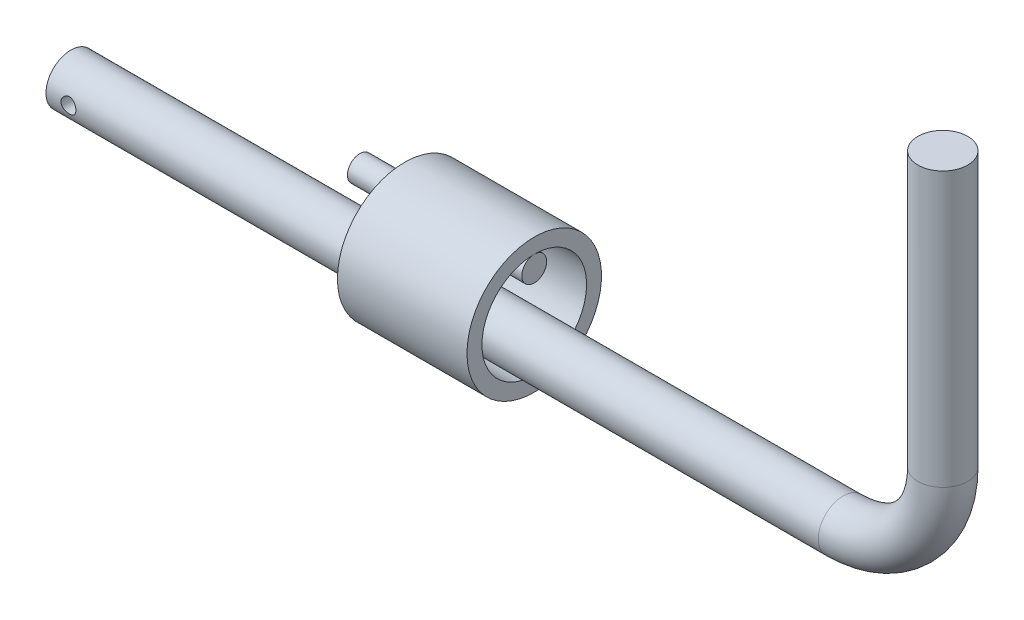
ISO-10303-21;
HEADER;
FILE_DESCRIPTION(('STEP AP214'),'2;1');
FILE_NAME('part.step','',(''),(''),'','','');
FILE_SCHEMA(('AUTOMOTIVE_DESIGN { 1 0 10303 214 1 1 1 1 }'));
ENDSEC;
DATA;
#1=APPLICATION_CONTEXT('core data for automotive mechanical design processes');
#2=APPLICATION_PROTOCOL_DEFINITION('international standard','automotive_design',2000,#1);
#3=PRODUCT_CONTEXT('',#1,'mechanical');
#4=PRODUCT('Part','Part','',(#3));
#5=PRODUCT_RELATED_PRODUCT_CATEGORY('part','',(#4));
#6=PRODUCT_DEFINITION_FORMATION('','',#4);
#7=PRODUCT_DEFINITION_CONTEXT('part definition',#1,'design');
#8=PRODUCT_DEFINITION('design','',#6,#7);
#9=PRODUCT_DEFINITION_SHAPE('','',#8);
#10=(LENGTH_UNIT() NAMED_UNIT(*) SI_UNIT(.MILLI.,.METRE.));
#11=(NAMED_UNIT(*) PLANE_ANGLE_UNIT() SI_UNIT($,.RADIAN.));
#12=(NAMED_UNIT(*) SI_UNIT($,.STERADIAN.) SOLID_ANGLE_UNIT());
#13=UNCERTAINTY_MEASURE_WITH_UNIT(LENGTH_MEASURE(1.E-05),#10,'distance_accuracy_value','');
#14=(GEOMETRIC_REPRESENTATION_CONTEXT(3) GLOBAL_UNCERTAINTY_ASSIGNED_CONTEXT((#13)) GLOBAL_UNIT_ASSIGNED_CONTEXT((#10,
#11,#12)) REPRESENTATION_CONTEXT('',''));
#15=CARTESIAN_POINT('',(0.,0.,0.));
#16=DIRECTION('',(0.,0.,1.));
#17=DIRECTION('',(1.,0.,0.));
#18=AXIS2_PLACEMENT_3D('',#15,#16,#17);
#19=CARTESIAN_POINT('',(58.,13.5,-1.11022302462516E-13));
#20=DIRECTION('',(1.,0.,0.));
#21=DIRECTION('',(0.,0.,-1.));
#22=AXIS2_PLACEMENT_3D('',#19,#20,#21);
#23=CYLINDRICAL_SURFACE('',#22,2.5);
#24=CARTESIAN_POINT('',(58.,13.5,-1.11022302462516E-13));
#25=DIRECTION('',(1.,0.,0.));
#26=DIRECTION('',(0.,0.,-1.));
#27=AXIS2_PLACEMENT_3D('',#24,#25,#26);
#28=CIRCLE('',#27,2.5);
#29=CARTESIAN_POINT('',(58.,13.5,-2.50000000000011));
#30=VERTEX_POINT('',#29);
#31=EDGE_CURVE('E11',#30,#30,#28,.T.);
#32=ORIENTED_EDGE('',*,*,#31,.T.);
#33=EDGE_LOOP('',(#32));
#34=FACE_BOUND('',#33,.T.);
#35=CARTESIAN_POINT('',(93.,13.5,-1.11022302462516E-13));
#36=DIRECTION('',(1.,0.,0.));
#37=DIRECTION('',(0.,0.,-1.));
#38=AXIS2_PLACEMENT_3D('',#35,#36,#37);
#39=CIRCLE('',#38,2.5);
#40=CARTESIAN_POINT('',(93.,13.5,-2.50000000000011));
#41=VERTEX_POINT('',#40);
#42=EDGE_CURVE('E52',#41,#41,#39,.T.);
#43=ORIENTED_EDGE('',*,*,#42,.F.);
#44=EDGE_LOOP('',(#43));
#45=FACE_BOUND('',#44,.T.);
#46=ADVANCED_FACE('F49',(#34,#45),#23,.T.);
#47=CARTESIAN_POINT('',(58.,13.5,-1.11022302462516E-13));
#48=DIRECTION('',(1.,0.,0.));
#49=DIRECTION('',(0.,0.,-1.));
#50=AXIS2_PLACEMENT_3D('',#47,#48,#49);
#51=PLANE('',#50);
#52=ORIENTED_EDGE('',*,*,#31,.F.);
#53=EDGE_LOOP('',(#52));
#54=FACE_BOUND('',#53,.T.);
#55=ADVANCED_FACE('F64',(#54),#51,.F.);
#56=CARTESIAN_POINT('',(93.,13.5,-1.11022302462516E-13));
#57=DIRECTION('',(1.,0.,0.));
#58=DIRECTION('',(0.,0.,-1.));
#59=AXIS2_PLACEMENT_3D('',#56,#57,#58);
#60=PLANE('',#59);
#61=ORIENTED_EDGE('',*,*,#42,.T.);
#62=EDGE_LOOP('',(#61));
#63=FACE_BOUND('',#62,.T.);
#64=ADVANCED_FACE('F61',(#63),#60,.T.);
#65=CLOSED_SHELL('',(#46,#55,#64));
#66=MANIFOLD_SOLID_BREP('B2',#65);
#67=CARTESIAN_POINT('',(93.,5.50000000000001,-1.11022302462516E-13));
#68=DIRECTION('',(-1.,0.,0.));
#69=DIRECTION('',(0.,0.,1.));
#70=AXIS2_PLACEMENT_3D('',#67,#68,#69);
#71=CYLINDRICAL_SURFACE('',#70,13.5);
#72=CARTESIAN_POINT('',(93.,5.50000000000001,-1.11022302462516E-13));
#73=DIRECTION('',(-1.,0.,0.));
#74=DIRECTION('',(0.,0.,1.));
#75=AXIS2_PLACEMENT_3D('',#72,#73,#74);
#76=CIRCLE('',#75,13.5);
#77=CARTESIAN_POINT('',(93.,5.50000000000001,13.4999999999999));
#78=VERTEX_POINT('',#77);
#79=EDGE_CURVE('E48',#78,#78,#76,.T.);
#80=CARTESIAN_POINT('',(67.,5.50000000000001,-1.11022302462516E-13));
#81=DIRECTION('',(-1.,0.,0.));
#82=DIRECTION('',(0.,0.,1.));
#83=AXIS2_PLACEMENT_3D('',#80,#81,#82);
#84=CIRCLE('',#83,13.5);
#85=CARTESIAN_POINT('',(67.,5.50000000000001,13.4999999999999));
#86=VERTEX_POINT('',#85);
#87=EDGE_CURVE('E103',#86,#86,#84,.T.);
#88=CARTESIAN_POINT('',(93.,5.50000000000001,13.4999999999999));
#89=CARTESIAN_POINT('',(92.7291666666667,5.50000000000001,13.4999999999999));
#90=CARTESIAN_POINT('',(92.4583333333333,5.50000000000001,13.4999999999999));
#91=CARTESIAN_POINT('',(91.9166666666667,5.50000000000001,13.4999999999999));
#92=CARTESIAN_POINT('',(91.6458333333333,5.50000000000001,13.4999999999999));
#93=CARTESIAN_POINT('',(91.1041666666667,5.50000000000001,13.4999999999999));
#94=CARTESIAN_POINT('',(90.8333333333333,5.50000000000001,13.4999999999999));
#95=CARTESIAN_POINT('',(90.2916666666667,5.50000000000001,13.4999999999999));
#96=CARTESIAN_POINT('',(90.0208333333333,5.50000000000001,13.4999999999999));
#97=CARTESIAN_POINT('',(89.4791666666667,5.50000000000001,13.4999999999999));
#98=CARTESIAN_POINT('',(89.2083333333333,5.50000000000001,13.4999999999999));
#99=CARTESIAN_POINT('',(88.6666666666667,5.50000000000001,13.4999999999999));
#100=CARTESIAN_POINT('',(88.3958333333333,5.50000000000001,13.4999999999999));
#101=CARTESIAN_POINT('',(87.8541666666667,5.50000000000001,13.4999999999999));
#102=CARTESIAN_POINT('',(87.5833333333333,5.50000000000001,13.4999999999999));
#103=CARTESIAN_POINT('',(87.0416666666667,5.50000000000001,13.4999999999999));
#104=CARTESIAN_POINT('',(86.7708333333333,5.50000000000001,13.4999999999999));
#105=CARTESIAN_POINT('',(86.2291666666667,5.50000000000001,13.4999999999999));
#106=CARTESIAN_POINT('',(85.9583333333333,5.50000000000001,13.4999999999999));
#107=CARTESIAN_POINT('',(85.4166666666667,5.50000000000001,13.4999999999999));
#108=CARTESIAN_POINT('',(85.1458333333333,5.50000000000001,13.4999999999999));
#109=CARTESIAN_POINT('',(84.6041666666667,5.50000000000001,13.4999999999999));
#110=CARTESIAN_POINT('',(84.3333333333333,5.50000000000001,13.4999999999999));
#111=CARTESIAN_POINT('',(83.7916666666667,5.50000000000001,13.4999999999999));
#112=CARTESIAN_POINT('',(83.5208333333333,5.50000000000001,13.4999999999999));
#113=CARTESIAN_POINT('',(82.9791666666667,5.50000000000001,13.4999999999999));
#114=CARTESIAN_POINT('',(82.7083333333333,5.50000000000001,13.4999999999999));
#115=CARTESIAN_POINT('',(82.1666666666667,5.50000000000001,13.4999999999999));
#116=CARTESIAN_POINT('',(81.8958333333333,5.50000000000001,13.4999999999999));
#117=CARTESIAN_POINT('',(81.3541666666667,5.50000000000001,13.4999999999999));
#118=CARTESIAN_POINT('',(81.0833333333333,5.50000000000001,13.4999999999999));
#119=CARTESIAN_POINT('',(80.5416666666667,5.50000000000001,13.4999999999999));
#120=CARTESIAN_POINT('',(80.2708333333333,5.50000000000001,13.4999999999999));
#121=CARTESIAN_POINT('',(79.7291666666667,5.50000000000001,13.4999999999999));
#122=CARTESIAN_POINT('',(79.4583333333333,5.50000000000001,13.4999999999999));
#123=CARTESIAN_POINT('',(78.9166666666667,5.50000000000001,13.4999999999999));
#124=CARTESIAN_POINT('',(78.6458333333333,5.50000000000001,13.4999999999999));
#125=CARTESIAN_POINT('',(78.1041666666667,5.50000000000001,13.4999999999999));
#126=CARTESIAN_POINT('',(77.8333333333333,5.50000000000001,13.4999999999999));
#127=CARTESIAN_POINT('',(77.2916666666667,5.50000000000001,13.4999999999999));
#128=CARTESIAN_POINT('',(77.0208333333333,5.50000000000001,13.4999999999999));
#129=CARTESIAN_POINT('',(76.4791666666667,5.50000000000001,13.4999999999999));
#130=CARTESIAN_POINT('',(76.2083333333334,5.50000000000001,13.4999999999999));
#131=CARTESIAN_POINT('',(75.6666666666667,5.50000000000001,13.4999999999999));
#132=CARTESIAN_POINT('',(75.3958333333333,5.50000000000001,13.4999999999999));
#133=CARTESIAN_POINT('',(74.8541666666667,5.50000000000001,13.4999999999999));
#134=CARTESIAN_POINT('',(74.5833333333333,5.50000000000001,13.4999999999999));
#135=CARTESIAN_POINT('',(74.0416666666667,5.50000000000001,13.4999999999999));
#136=CARTESIAN_POINT('',(73.7708333333333,5.50000000000001,13.4999999999999));
#137=CARTESIAN_POINT('',(73.2291666666667,5.50000000000001,13.4999999999999));
#138=CARTESIAN_POINT('',(72.9583333333333,5.50000000000001,13.4999999999999));
#139=CARTESIAN_POINT('',(72.4166666666667,5.50000000000001,13.4999999999999));
#140=CARTESIAN_POINT('',(72.1458333333333,5.50000000000001,13.4999999999999));
#141=CARTESIAN_POINT('',(71.6041666666667,5.50000000000001,13.4999999999999));
#142=CARTESIAN_POINT('',(71.3333333333333,5.50000000000001,13.4999999999999));
#143=CARTESIAN_POINT('',(70.7916666666667,5.50000000000001,13.4999999999999));
#144=CARTESIAN_POINT('',(70.5208333333333,5.50000000000001,13.4999999999999));
#145=CARTESIAN_POINT('',(69.9791666666667,5.50000000000001,13.4999999999999));
#146=CARTESIAN_POINT('',(69.7083333333333,5.50000000000001,13.4999999999999));
#147=CARTESIAN_POINT('',(69.1666666666667,5.50000000000001,13.4999999999999));
#148=CARTESIAN_POINT('',(68.8958333333334,5.50000000000001,13.4999999999999));
#149=CARTESIAN_POINT('',(68.3541666666667,5.50000000000001,13.4999999999999));
#150=CARTESIAN_POINT('',(68.0833333333333,5.50000000000001,13.4999999999999));
#151=CARTESIAN_POINT('',(67.5416666666667,5.50000000000001,13.4999999999999));
#152=CARTESIAN_POINT('',(67.2708333333333,5.50000000000001,13.4999999999999));
#153=CARTESIAN_POINT('',(67.,5.50000000000001,13.4999999999999));
#154=B_SPLINE_CURVE_WITH_KNOTS('',3,(#88,#89,#90,#91,#92,#93,#94,#95,#96,#97,#98,#99,#100,#101,
#102,#103,#104,#105,#106,#107,#108,#109,#110,#111,#112,#113,#114,#115,#116,#117,#118,#119,#120,
#121,#122,#123,#124,#125,#126,#127,#128,#129,#130,#131,#132,#133,#134,#135,#136,#137,#138,#139,
#140,#141,#142,#143,#144,#145,#146,#147,#148,#149,#150,#151,#152,#153),.UNSPECIFIED.,.F.,.F.,(4,
2,2,2,2,2,2,2,2,2,2,2,2,2,2,2,2,2,2,2,2,2,2,2,2,2,2,2,2,2,2,2,4),(0.,0.812499999999994,
1.62499999999999,2.4375,3.24999999999999,4.0625,4.87499999999999,5.68749999999998,
6.49999999999999,7.31249999999999,8.12499999999999,8.93749999999999,9.74999999999999,10.5625,
11.375,12.1875,13.,13.8125,14.625,15.4375,16.25,17.0625,17.875,18.6875,19.5,20.3125,21.125,
21.9375,22.75,23.5625,24.375,25.1875,26.),.UNSPECIFIED.);
#155=EDGE_CURVE('BSEAM100',#78,#86,#154,.T.);
#156=ORIENTED_EDGE('',*,*,#79,.T.);
#157=ORIENTED_EDGE('',*,*,#87,.F.);
#158=ORIENTED_EDGE('',*,*,#155,.T.);
#159=ORIENTED_EDGE('',*,*,#155,.F.);
#160=EDGE_LOOP('',(#156,#158,#157,#159));
#161=FACE_BOUND('',#160,.T.);
#162=ADVANCED_FACE('F100',(#161),#71,.T.);
#163=CARTESIAN_POINT('',(93.,5.50000000000001,-1.11022302462516E-13));
#164=DIRECTION('',(-1.,0.,0.));
#165=DIRECTION('',(0.,0.,1.));
#166=AXIS2_PLACEMENT_3D('',#163,#164,#165);
#167=PLANE('',#166);
#168=CARTESIAN_POINT('',(93.,5.50000000000001,-1.11022302462516E-13));
#169=DIRECTION('',(-1.,0.,0.));
#170=DIRECTION('',(0.,0.,1.));
#171=AXIS2_PLACEMENT_3D('',#168,#169,#170);
#172=CIRCLE('',#171,10.5);
#173=CARTESIAN_POINT('',(93.,5.50000000000001,10.4999999999999));
#174=VERTEX_POINT('',#173);
#175=EDGE_CURVE('E110',#174,#174,#172,.T.);
#176=ORIENTED_EDGE('',*,*,#175,.T.);
#177=EDGE_LOOP('',(#176));
#178=FACE_BOUND('',#177,.T.);
#179=ORIENTED_EDGE('',*,*,#79,.F.);
#180=EDGE_LOOP('',(#179));
#181=FACE_BOUND('',#180,.T.);
#182=ADVANCED_FACE('F118',(#178,#181),#167,.F.);
#183=CARTESIAN_POINT('',(67.,5.50000000000001,-1.11022302462516E-13));
#184=DIRECTION('',(-1.,0.,0.));
#185=DIRECTION('',(0.,0.,1.));
#186=AXIS2_PLACEMENT_3D('',#183,#184,#185);
#187=PLANE('',#186);
#188=CARTESIAN_POINT('',(67.,5.50000000000001,-1.11022302462516E-13));
#189=DIRECTION('',(-1.,0.,0.));
#190=DIRECTION('',(0.,0.,1.));
#191=AXIS2_PLACEMENT_3D('',#188,#189,#190);
#192=CIRCLE('',#191,10.5);
#193=CARTESIAN_POINT('',(67.,5.50000000000001,10.4999999999999));
#194=VERTEX_POINT('',#193);
#195=EDGE_CURVE('E112',#194,#194,#192,.T.);
#196=ORIENTED_EDGE('',*,*,#195,.F.);
#197=EDGE_LOOP('',(#196));
#198=FACE_BOUND('',#197,.T.);
#199=ORIENTED_EDGE('',*,*,#87,.T.);
#200=EDGE_LOOP('',(#199));
#201=FACE_BOUND('',#200,.T.);
#202=ADVANCED_FACE('F124',(#198,#201),#187,.T.);
#203=CARTESIAN_POINT('',(93.,5.50000000000001,-1.11022302462516E-13));
#204=DIRECTION('',(-1.,0.,0.));
#205=DIRECTION('',(0.,0.,1.));
#206=AXIS2_PLACEMENT_3D('',#203,#204,#205);
#207=CYLINDRICAL_SURFACE('',#206,10.5);
#208=CARTESIAN_POINT('',(93.,5.50000000000001,10.4999999999999));
#209=CARTESIAN_POINT('',(92.7291666666667,5.50000000000001,10.4999999999999));
#210=CARTESIAN_POINT('',(92.4583333333333,5.50000000000001,10.4999999999999));
#211=CARTESIAN_POINT('',(91.9166666666667,5.50000000000001,10.4999999999999));
#212=CARTESIAN_POINT('',(91.6458333333333,5.50000000000001,10.4999999999999));
#213=CARTESIAN_POINT('',(91.1041666666667,5.50000000000001,10.4999999999999));
#214=CARTESIAN_POINT('',(90.8333333333333,5.50000000000001,10.4999999999999));
#215=CARTESIAN_POINT('',(90.2916666666667,5.50000000000001,10.4999999999999));
#216=CARTESIAN_POINT('',(90.0208333333333,5.50000000000001,10.4999999999999));
#217=CARTESIAN_POINT('',(89.4791666666667,5.50000000000001,10.4999999999999));
#218=CARTESIAN_POINT('',(89.2083333333333,5.50000000000001,10.4999999999999));
#219=CARTESIAN_POINT('',(88.6666666666667,5.50000000000001,10.4999999999999));
#220=CARTESIAN_POINT('',(88.3958333333333,5.50000000000001,10.4999999999999));
#221=CARTESIAN_POINT('',(87.8541666666667,5.50000000000001,10.4999999999999));
#222=CARTESIAN_POINT('',(87.5833333333333,5.50000000000001,10.4999999999999));
#223=CARTESIAN_POINT('',(87.0416666666667,5.50000000000001,10.4999999999999));
#224=CARTESIAN_POINT('',(86.7708333333333,5.50000000000001,10.4999999999999));
#225=CARTESIAN_POINT('',(86.2291666666667,5.50000000000001,10.4999999999999));
#226=CARTESIAN_POINT('',(85.9583333333333,5.50000000000001,10.4999999999999));
#227=CARTESIAN_POINT('',(85.4166666666667,5.50000000000001,10.4999999999999));
#228=CARTESIAN_POINT('',(85.1458333333333,5.50000000000001,10.4999999999999));
#229=CARTESIAN_POINT('',(84.6041666666667,5.50000000000001,10.4999999999999));
#230=CARTESIAN_POINT('',(84.3333333333333,5.50000000000001,10.4999999999999));
#231=CARTESIAN_POINT('',(83.7916666666667,5.50000000000001,10.4999999999999));
#232=CARTESIAN_POINT('',(83.5208333333333,5.50000000000001,10.4999999999999));
#233=CARTESIAN_POINT('',(82.9791666666667,5.50000000000001,10.4999999999999));
#234=CARTESIAN_POINT('',(82.7083333333333,5.50000000000001,10.4999999999999));
#235=CARTESIAN_POINT('',(82.1666666666667,5.50000000000001,10.4999999999999));
#236=CARTESIAN_POINT('',(81.8958333333333,5.50000000000001,10.4999999999999));
#237=CARTESIAN_POINT('',(81.3541666666667,5.50000000000001,10.4999999999999));
#238=CARTESIAN_POINT('',(81.0833333333333,5.50000000000001,10.4999999999999));
#239=CARTESIAN_POINT('',(80.5416666666667,5.50000000000001,10.4999999999999));
#240=CARTESIAN_POINT('',(80.2708333333333,5.50000000000001,10.4999999999999));
#241=CARTESIAN_POINT('',(79.7291666666667,5.50000000000001,10.4999999999999));
#242=CARTESIAN_POINT('',(79.4583333333333,5.50000000000001,10.4999999999999));
#243=CARTESIAN_POINT('',(78.9166666666667,5.50000000000001,10.4999999999999));
#244=CARTESIAN_POINT('',(78.6458333333333,5.50000000000001,10.4999999999999));
#245=CARTESIAN_POINT('',(78.1041666666667,5.50000000000001,10.4999999999999));
#246=CARTESIAN_POINT('',(77.8333333333333,5.50000000000001,10.4999999999999));
#247=CARTESIAN_POINT('',(77.2916666666667,5.50000000000001,10.4999999999999));
#248=CARTESIAN_POINT('',(77.0208333333333,5.50000000000001,10.4999999999999));
#249=CARTESIAN_POINT('',(76.4791666666667,5.50000000000001,10.4999999999999));
#250=CARTESIAN_POINT('',(76.2083333333334,5.50000000000001,10.4999999999999));
#251=CARTESIAN_POINT('',(75.6666666666667,5.50000000000001,10.4999999999999));
#252=CARTESIAN_POINT('',(75.3958333333333,5.50000000000001,10.4999999999999));
#253=CARTESIAN_POINT('',(74.8541666666667,5.50000000000001,10.4999999999999));
#254=CARTESIAN_POINT('',(74.5833333333333,5.50000000000001,10.4999999999999));
#255=CARTESIAN_POINT('',(74.0416666666667,5.50000000000001,10.4999999999999));
#256=CARTESIAN_POINT('',(73.7708333333333,5.50000000000001,10.4999999999999));
#257=CARTESIAN_POINT('',(73.2291666666667,5.50000000000001,10.4999999999999));
#258=CARTESIAN_POINT('',(72.9583333333333,5.50000000000001,10.4999999999999));
#259=CARTESIAN_POINT('',(72.4166666666667,5.50000000000001,10.4999999999999));
#260=CARTESIAN_POINT('',(72.1458333333333,5.50000000000001,10.4999999999999));
#261=CARTESIAN_POINT('',(71.6041666666667,5.50000000000001,10.4999999999999));
#262=CARTESIAN_POINT('',(71.3333333333333,5.50000000000001,10.4999999999999));
#263=CARTESIAN_POINT('',(70.7916666666667,5.50000000000001,10.4999999999999));
#264=CARTESIAN_POINT('',(70.5208333333333,5.50000000000001,10.4999999999999));
#265=CARTESIAN_POINT('',(69.9791666666667,5.50000000000001,10.4999999999999));
#266=CARTESIAN_POINT('',(69.7083333333333,5.50000000000001,10.4999999999999));
#267=CARTESIAN_POINT('',(69.1666666666667,5.50000000000001,10.4999999999999));
#268=CARTESIAN_POINT('',(68.8958333333334,5.50000000000001,10.4999999999999));
#269=CARTESIAN_POINT('',(68.3541666666667,5.50000000000001,10.4999999999999));
#270=CARTESIAN_POINT('',(68.0833333333333,5.50000000000001,10.4999999999999));
#271=CARTESIAN_POINT('',(67.5416666666667,5.50000000000001,10.4999999999999));
#272=CARTESIAN_POINT('',(67.2708333333333,5.50000000000001,10.4999999999999));
#273=CARTESIAN_POINT('',(67.,5.50000000000001,10.4999999999999));
#274=B_SPLINE_CURVE_WITH_KNOTS('',3,(#208,#209,#210,#211,#212,#213,#214,#215,#216,#217,#218,
#219,#220,#221,#222,#223,#224,#225,#226,#227,#228,#229,#230,#231,#232,#233,#234,#235,#236,#237,
#238,#239,#240,#241,#242,#243,#244,#245,#246,#247,#248,#249,#250,#251,#252,#253,#254,#255,#256,
#257,#258,#259,#260,#261,#262,#263,#264,#265,#266,#267,#268,#269,#270,#271,#272,#273),
.UNSPECIFIED.,.F.,.F.,(4,2,2,2,2,2,2,2,2,2,2,2,2,2,2,2,2,2,2,2,2,2,2,2,2,2,2,2,2,2,2,2,4),(0.,
0.812500000000008,1.625,2.43750000000001,3.25,4.06250000000001,4.875,5.6875,6.50000000000001,
7.3125,8.12500000000001,8.9375,9.75000000000001,10.5625,11.375,12.1875,13.,13.8125,14.625,
15.4375,16.25,17.0625,17.875,18.6875,19.5,20.3125,21.125,21.9375,22.75,23.5625,24.375,25.1875,
26.),.UNSPECIFIED.);
#275=EDGE_CURVE('BSEAM121',#174,#194,#274,.T.);
#276=ORIENTED_EDGE('',*,*,#175,.F.);
#277=ORIENTED_EDGE('',*,*,#195,.T.);
#278=ORIENTED_EDGE('',*,*,#275,.T.);
#279=ORIENTED_EDGE('',*,*,#275,.F.);
#280=EDGE_LOOP('',(#276,#278,#277,#279));
#281=FACE_BOUND('',#280,.T.);
#282=ADVANCED_FACE('F121',(#281),#207,.F.);
#283=CLOSED_SHELL('',(#162,#182,#202,#282));
#284=MANIFOLD_SOLID_BREP('B6',#283);
#285=CARTESIAN_POINT('',(0.,0.,0.));
#286=DIRECTION('',(1.,0.,0.));
#287=DIRECTION('',(0.,0.,-1.));
#288=AXIS2_PLACEMENT_3D('',#285,#286,#287);
#289=PLANE('',#288);
#290=CARTESIAN_POINT('',(0.,0.,0.));
#291=DIRECTION('',(1.,0.,0.));
#292=DIRECTION('',(0.,0.,-1.));
#293=AXIS2_PLACEMENT_3D('',#290,#291,#292);
#294=CIRCLE('',#293,5.);
#295=CARTESIAN_POINT('',(0.,0.,-5.00000000000023));
#296=VERTEX_POINT('',#295);
#297=EDGE_CURVE('E175',#296,#296,#294,.T.);
#298=ORIENTED_EDGE('',*,*,#297,.F.);
#299=EDGE_LOOP('',(#298));
#300=FACE_BOUND('',#299,.T.);
#301=ADVANCED_FACE('F159',(#300),#289,.F.);
#302=CARTESIAN_POINT('',(175.,75.,-1.11022302462516E-13));
#303=DIRECTION('',(0.,1.,0.));
#304=DIRECTION('',(0.,0.,-1.));
#305=AXIS2_PLACEMENT_3D('',#302,#303,#304);
#306=PLANE('',#305);
#307=CARTESIAN_POINT('',(175.,75.,-1.11022302462516E-13));
#308=DIRECTION('',(0.,1.,0.));
#309=DIRECTION('',(0.,0.,-1.));
#310=AXIS2_PLACEMENT_3D('',#307,#308,#309);
#311=CIRCLE('',#310,5.);
#312=CARTESIAN_POINT('',(175.,75.,-5.00000000000012));
#313=VERTEX_POINT('',#312);
#314=EDGE_CURVE('E179',#313,#313,#311,.T.);
#315=ORIENTED_EDGE('',*,*,#314,.T.);
#316=EDGE_LOOP('',(#315));
#317=FACE_BOUND('',#316,.T.);
#318=ADVANCED_FACE('F180',(#317),#306,.T.);
#319=CARTESIAN_POINT('',(0.,0.,0.));
#320=DIRECTION('',(1.,0.,0.));
#321=DIRECTION('',(0.,0.,-1.));
#322=AXIS2_PLACEMENT_3D('',#319,#320,#321);
#323=CYLINDRICAL_SURFACE('',#322,5.);
#324=CARTESIAN_POINT('',(6.,0.,-5.00000000000023));
#325=CARTESIAN_POINT('',(5.99999900251511,-0.0822886127532721,-4.99999929250573));
#326=CARTESIAN_POINT('',(5.99320613637603,-0.164587318351501,-4.99794915693957));
#327=CARTESIAN_POINT('',(5.9662786457779,-0.326788125304866,-4.98997105593687));
#328=CARTESIAN_POINT('',(5.94614004197667,-0.406689504411419,-4.98404193389701));
#329=CARTESIAN_POINT('',(5.89325398308974,-0.561732707754526,-4.96895552501847));
#330=CARTESIAN_POINT('',(5.86052513038106,-0.636881364395358,-4.95980300250426));
#331=CARTESIAN_POINT('',(5.78346390694416,-0.780624181053123,-4.93922109237645));
#332=CARTESIAN_POINT('',(5.73912999260459,-0.849217467469682,-4.92779140192074));
#333=CARTESIAN_POINT('',(5.63877599252733,-0.979871797183755,-4.90350737192783));
#334=CARTESIAN_POINT('',(5.58248337411407,-1.04171807124433,-4.89062383657038));
#335=CARTESIAN_POINT('',(5.4603907700898,-1.15524920923323,-4.8650583421044));
#336=CARTESIAN_POINT('',(5.39458918787504,-1.20693236327443,-4.85237641724503));
#337=CARTESIAN_POINT('',(5.2535292469624,-1.29980037723709,-4.82834113993774));
#338=CARTESIAN_POINT('',(5.17809153900926,-1.34072309022212,-4.81702406663873));
#339=CARTESIAN_POINT('',(5.0210107457697,-1.40921394774757,-4.79743620394034));
#340=CARTESIAN_POINT('',(4.93936915607203,-1.43678529919972,-4.78916468313323));
#341=CARTESIAN_POINT('',(4.77460973386955,-1.47701633682651,-4.77690870838445));
#342=CARTESIAN_POINT('',(4.69159725613606,-1.49007196234675,-4.77281069324533));
#343=CARTESIAN_POINT('',(4.52446684378324,-1.50213730614668,-4.76902789749769));
#344=CARTESIAN_POINT('',(4.44034918194092,-1.50115042761075,-4.76934204760586));
#345=CARTESIAN_POINT('',(4.27661609139152,-1.48546977199808,-4.77424744067792));
#346=CARTESIAN_POINT('',(4.19694774963776,-1.47127205262682,-4.77868388599142));
#347=CARTESIAN_POINT('',(4.04118021372654,-1.43037420427053,-4.79108356228625));
#348=CARTESIAN_POINT('',(3.96508137262567,-1.40367284141639,-4.79904714132362));
#349=CARTESIAN_POINT('',(3.81739965033927,-1.3381602665368,-4.81772733074986));
#350=CARTESIAN_POINT('',(3.74589291604474,-1.29918816934639,-4.82848016115955));
#351=CARTESIAN_POINT('',(3.61026797798981,-1.2103522258868,-4.85150987000063));
#352=CARTESIAN_POINT('',(3.54615157058622,-1.16048574002586,-4.86378711746996));
#353=CARTESIAN_POINT('',(3.42431380923798,-1.04881290765544,-4.88911011297944));
#354=CARTESIAN_POINT('',(3.36697133597033,-0.986594907466942,-4.90216654310498));
#355=CARTESIAN_POINT('',(3.26344601593575,-0.853263259313937,-4.92712244063259));
#356=CARTESIAN_POINT('',(3.21726387158558,-0.782149051860869,-4.93902183518416));
#357=CARTESIAN_POINT('',(3.13714007753528,-0.632355038342791,-4.96043160069478));
#358=CARTESIAN_POINT('',(3.10328248375015,-0.553627749747935,-4.96992543668316));
#359=CARTESIAN_POINT('',(3.04940040990038,-0.391245415603505,-4.9853352183222));
#360=CARTESIAN_POINT('',(3.02937207146751,-0.307591751589571,-4.99125216186997));
#361=CARTESIAN_POINT('',(3.00434782210061,-0.140952242668319,-4.99868364643536));
#362=CARTESIAN_POINT('',(2.99883841419839,-0.0580500976011677,-5.00034850417787));
#363=CARTESIAN_POINT('',(3.00156915571209,0.107499605823418,-4.99952923241763));
#364=CARTESIAN_POINT('',(3.00980746965145,0.190147196690826,-4.99704565677768));
#365=CARTESIAN_POINT('',(3.0393846111115,0.350903605309734,-4.98830696987172));
#366=CARTESIAN_POINT('',(3.06042338758086,0.429072772614189,-4.98213829799416));
#367=CARTESIAN_POINT('',(3.1146432327782,0.58075463895452,-4.96674347841533));
#368=CARTESIAN_POINT('',(3.14782576103788,0.654266777025576,-4.95751696321097));
#369=CARTESIAN_POINT('',(3.22625316548113,0.796437189461044,-4.93669654351339));
#370=CARTESIAN_POINT('',(3.27175934094795,0.864943826199666,-4.92505280829678));
#371=CARTESIAN_POINT('',(3.37322475405279,0.993523307980133,-4.90073468764314));
#372=CARTESIAN_POINT('',(3.42918661188768,1.05359403235591,-4.88806004431081));
#373=CARTESIAN_POINT('',(3.55238730836935,1.16585744551025,-4.86253171869138));
#374=CARTESIAN_POINT('',(3.61996187577172,1.21768481231504,-4.84968825033263));
#375=CARTESIAN_POINT('',(3.76312793901351,1.30928995072156,-4.82576515238468));
#376=CARTESIAN_POINT('',(3.83871922455822,1.34906803829474,-4.8146854765467));
#377=CARTESIAN_POINT('',(3.99553249125469,1.41517347127171,-4.79567189615072));
#378=CARTESIAN_POINT('',(4.07672618653658,1.44156346937053,-4.78772337843829));
#379=CARTESIAN_POINT('',(4.24268796893146,1.48021730815115,-4.77591594362791));
#380=CARTESIAN_POINT('',(4.32745482078766,1.49248598978776,-4.77205562508307));
#381=CARTESIAN_POINT('',(4.49436151837624,1.50221984485057,-4.76899972496096));
#382=CARTESIAN_POINT('',(4.5764636510176,1.50028055308492,-4.76961647442757));
#383=CARTESIAN_POINT('',(4.73911410337281,1.48307505444817,-4.7749940128829));
#384=CARTESIAN_POINT('',(4.81966248517636,1.46780938124716,-4.77975463592546));
#385=CARTESIAN_POINT('',(4.97594539914286,1.42476888804136,-4.79275763670382));
#386=CARTESIAN_POINT('',(5.05172728736171,1.39715175507071,-4.80095604545963));
#387=CARTESIAN_POINT('',(5.19764243881774,1.3303150712113,-4.81990278909136));
#388=CARTESIAN_POINT('',(5.26777461764076,1.29109329962873,-4.83065161194311));
#389=CARTESIAN_POINT('',(5.40316311652712,1.20048763805067,-4.85397676425831));
#390=CARTESIAN_POINT('',(5.46814876126044,1.14871276092993,-4.86660540163795));
#391=CARTESIAN_POINT('',(5.5887024983079,1.03517434629783,-4.89201320450028));
#392=CARTESIAN_POINT('',(5.64426813946777,0.973408217134511,-4.90479240823914));
#393=CARTESIAN_POINT('',(5.74602341229503,0.839465762183249,-4.92950936570656));
#394=CARTESIAN_POINT('',(5.79189144685551,0.767037885790605,-4.94141159765672));
#395=CARTESIAN_POINT('',(5.87073516990405,0.615141373983523,-4.96260680455815));
#396=CARTESIAN_POINT('',(5.90371688827451,0.535676052998948,-4.97190099931081));
#397=CARTESIAN_POINT('',(5.95289527565275,0.380757712655274,-4.98602174969311));
#398=CARTESIAN_POINT('',(5.97051167288325,0.305786961954228,-4.99122027381065));
#399=CARTESIAN_POINT('',(5.99406352524159,0.153880195230785,-4.99820944494495));
#400=CARTESIAN_POINT('',(6.00000093270482,0.0769445098581561,-5.00000066154762));
#401=CARTESIAN_POINT('',(6.,0.,-5.00000000000023));
#402=B_SPLINE_CURVE_WITH_KNOTS('',3,(#324,#325,#326,#327,#328,#329,#330,#331,#332,#333,#334,
#335,#336,#337,#338,#339,#340,#341,#342,#343,#344,#345,#346,#347,#348,#349,#350,#351,#352,#353,
#354,#355,#356,#357,#358,#359,#360,#361,#362,#363,#364,#365,#366,#367,#368,#369,#370,#371,#372,
#373,#374,#375,#376,#377,#378,#379,#380,#381,#382,#383,#384,#385,#386,#387,#388,#389,#390,#391,
#392,#393,#394,#395,#396,#397,#398,#399,#400,#401),.UNSPECIFIED.,.T.,.F.,(4,2,2,2,2,2,2,2,2,2,2,
2,2,2,2,2,2,2,2,2,2,2,2,2,2,2,2,2,2,2,2,2,2,2,2,2,2,2,4),(0.,0.246583203612621,
0.493239964846026,0.739533676300904,0.985860164412734,1.23855602948195,1.49129437288637,
1.74971481004112,2.00807314543225,2.259196893566,2.51025978319091,2.75226016697678,
2.99428443658003,3.23962426447121,3.48502360158556,3.74067104048168,3.99633456531072,
4.25371046881688,4.51101453528806,4.75908809438546,5.00712853550329,5.24956746682326,
5.49203554593725,5.74011305702905,5.98825282000189,6.24540400322817,6.50254844252679,
6.7584781495125,7.01432009460282,7.25950155466942,7.50467319661599,7.74680040402721,
7.98897397553109,8.23996925679933,8.49102974897503,8.74942996156672,9.00770911595238,
9.2383169193046,9.46888616948873),.UNSPECIFIED.);
#403=CARTESIAN_POINT('',(6.,0.,-5.00000000000023));
#404=VERTEX_POINT('',#403);
#405=EDGE_CURVE('E98',#404,#404,#402,.T.);
#406=ORIENTED_EDGE('',*,*,#405,.F.);
#407=EDGE_LOOP('',(#406));
#408=FACE_BOUND('',#407,.T.);
#409=CARTESIAN_POINT('',(6.,0.,4.99999999999989));
#410=CARTESIAN_POINT('',(5.99999900251512,0.0822886127533039,4.99999929250539));
#411=CARTESIAN_POINT('',(5.99320613637604,0.164587318351538,4.99794915693954));
#412=CARTESIAN_POINT('',(5.96627864577791,0.326788125304886,4.9899710559369));
#413=CARTESIAN_POINT('',(5.94614004197666,0.406689504411417,4.98404193389679));
#414=CARTESIAN_POINT('',(5.89325398308974,0.561732707754533,4.96895552501824));
#415=CARTESIAN_POINT('',(5.86052513038107,0.636881364395397,4.95980300250425));
#416=CARTESIAN_POINT('',(5.78346390694417,0.780624181053157,4.93922109237645));
#417=CARTESIAN_POINT('',(5.73912999260459,0.849217467469678,4.92779140192053));
#418=CARTESIAN_POINT('',(5.63877599252733,0.979871797183755,4.9035073719276));
#419=CARTESIAN_POINT('',(5.58248337411408,1.04171807124437,4.89062383657034));
#420=CARTESIAN_POINT('',(5.46039077008981,1.15524920923327,4.86505834210443));
#421=CARTESIAN_POINT('',(5.39458918787504,1.20693236327443,4.85237641724492));
#422=CARTESIAN_POINT('',(5.25352924696239,1.29980037723709,4.82834113993762));
#423=CARTESIAN_POINT('',(5.17809153900926,1.34072309022216,4.81702406663874));
#424=CARTESIAN_POINT('',(5.02101074576971,1.40921394774763,4.7974362039403));
#425=CARTESIAN_POINT('',(4.93936915607203,1.43678529919975,4.78916468313299));
#426=CARTESIAN_POINT('',(4.77460973386955,1.47701633682653,4.77690870838425));
#427=CARTESIAN_POINT('',(4.69159725613606,1.49007196234681,4.77281069324535));
#428=CARTESIAN_POINT('',(4.52446684378324,1.50213730614674,4.76902789749764));
#429=CARTESIAN_POINT('',(4.44034918194092,1.50115042761078,4.76934204760552));
#430=CARTESIAN_POINT('',(4.27661609139152,1.48546977199811,4.77424744067759));
#431=CARTESIAN_POINT('',(4.19694774963777,1.47127205262688,4.77868388599137));
#432=CARTESIAN_POINT('',(4.04118021372655,1.43037420427059,4.79108356228626));
#433=CARTESIAN_POINT('',(3.96508137262567,1.40367284141642,4.79904714132342));
#434=CARTESIAN_POINT('',(3.81739965033926,1.33816026653682,4.81772733074962));
#435=CARTESIAN_POINT('',(3.74589291604473,1.29918816934645,4.8284801611595));
#436=CARTESIAN_POINT('',(3.61026797798981,1.21035222588685,4.85150987000065));
#437=CARTESIAN_POINT('',(3.54615157058623,1.16048574002587,4.86378711746985));
#438=CARTESIAN_POINT('',(3.42431380923798,1.04881290765544,4.88911011297932));
#439=CARTESIAN_POINT('',(3.36697133597032,0.98659490746698,4.902166543105));
#440=CARTESIAN_POINT('',(3.26344601593574,0.853263259313978,4.92712244063256));
#441=CARTESIAN_POINT('',(3.21726387158557,0.782149051860873,4.93902183518394));
#442=CARTESIAN_POINT('',(3.13714007753528,0.632355038342787,4.96043160069455));
#443=CARTESIAN_POINT('',(3.10328248375014,0.553627749747959,4.96992543668313));
#444=CARTESIAN_POINT('',(3.04940040990037,0.391245415603546,4.98533521832222));
#445=CARTESIAN_POINT('',(3.02937207146751,0.307591751589602,4.99125216186987));
#446=CARTESIAN_POINT('',(3.00434782210061,0.140952242668342,4.99868364643524));
#447=CARTESIAN_POINT('',(2.9988384141984,0.0580500976011927,5.00034850417787));
#448=CARTESIAN_POINT('',(3.00156915571208,-0.107499605823389,4.99952923241763));
#449=CARTESIAN_POINT('',(3.00980746965144,-0.190147196690795,4.99704565677755));
#450=CARTESIAN_POINT('',(3.03938461111151,-0.35090360530972,4.98830696987162));
#451=CARTESIAN_POINT('',(3.06042338758089,-0.429072772614195,4.98213829799421));
#452=CARTESIAN_POINT('',(3.11464323277822,-0.580754638954542,4.96674347841527));
#453=CARTESIAN_POINT('',(3.14782576103786,-0.654266777025596,4.95751696321064));
#454=CARTESIAN_POINT('',(3.22625316548114,-0.796437189461059,4.93669654351305));
#455=CARTESIAN_POINT('',(3.271759340948,-0.864943826199679,4.92505280829673));
#456=CARTESIAN_POINT('',(3.37322475405284,-0.993523307980145,4.9007346876432));
#457=CARTESIAN_POINT('',(3.42918661188768,-1.05359403235592,4.88806004431069));
#458=CARTESIAN_POINT('',(3.55238730836935,-1.16585744551024,4.86253171869127));
#459=CARTESIAN_POINT('',(3.61996187577176,-1.21768481231501,4.84968825033269));
#460=CARTESIAN_POINT('',(3.76312793901356,-1.30928995072153,4.82576515238463));
#461=CARTESIAN_POINT('',(3.83871922455822,-1.34906803829471,4.81468547654635));
#462=CARTESIAN_POINT('',(3.99553249125469,-1.41517347127167,4.7956718961504));
#463=CARTESIAN_POINT('',(4.0767261865366,-1.44156346937047,4.78772337843827));
#464=CARTESIAN_POINT('',(4.2426879689315,-1.48021730815111,4.77591594362795));
#465=CARTESIAN_POINT('',(4.32745482078768,-1.49248598978777,4.77205562508286));
#466=CARTESIAN_POINT('',(4.49436151837623,-1.50221984485056,4.76899972496072));
#467=CARTESIAN_POINT('',(4.57646365101758,-1.50028055308486,4.76961647442752));
#468=CARTESIAN_POINT('',(4.7391141033728,-1.48307505444811,4.77499401288298));
#469=CARTESIAN_POINT('',(4.81966248517636,-1.46780938124716,4.77975463592547));
#470=CARTESIAN_POINT('',(4.97594539914285,-1.42476888804137,4.79275763670381));
#471=CARTESIAN_POINT('',(5.05172728736168,-1.39715175507067,4.80095604545967));
#472=CARTESIAN_POINT('',(5.19764243881771,-1.33031507121127,4.81990278909135));
#473=CARTESIAN_POINT('',(5.26777461764076,-1.29109329962874,4.83065161194299));
#474=CARTESIAN_POINT('',(5.40316311652712,-1.20048763805071,4.85397676425821));
#475=CARTESIAN_POINT('',(5.4681487612604,-1.14871276092993,4.86660540163798));
#476=CARTESIAN_POINT('',(5.58870249830785,-1.03517434629781,4.89201320450025));
#477=CARTESIAN_POINT('',(5.64426813946776,-0.97340821713448,4.90479240823891));
#478=CARTESIAN_POINT('',(5.74602341229504,-0.839465762183229,4.92950936570634));
#479=CARTESIAN_POINT('',(5.79189144685548,-0.7670378857906,4.94141159765673));
#480=CARTESIAN_POINT('',(5.87073516990402,-0.615141373983525,4.96260680455814));
#481=CARTESIAN_POINT('',(5.90371688827451,-0.535676052998943,4.97190099931056));
#482=CARTESIAN_POINT('',(5.95289527565275,-0.380757712655269,4.98602174969291));
#483=CARTESIAN_POINT('',(5.97051167288325,-0.305786961954229,4.99122027381068));
#484=CARTESIAN_POINT('',(5.99406352524158,-0.153880195230781,4.99820944494492));
#485=CARTESIAN_POINT('',(6.00000093270482,-0.0769445098581406,5.0000006615473));
#486=CARTESIAN_POINT('',(6.,0.,4.99999999999989));
#487=B_SPLINE_CURVE_WITH_KNOTS('',3,(#409,#410,#411,#412,#413,#414,#415,#416,#417,#418,#419,
#420,#421,#422,#423,#424,#425,#426,#427,#428,#429,#430,#431,#432,#433,#434,#435,#436,#437,#438,
#439,#440,#441,#442,#443,#444,#445,#446,#447,#448,#449,#450,#451,#452,#453,#454,#455,#456,#457,
#458,#459,#460,#461,#462,#463,#464,#465,#466,#467,#468,#469,#470,#471,#472,#473,#474,#475,#476,
#477,#478,#479,#480,#481,#482,#483,#484,#485,#486),.UNSPECIFIED.,.T.,.F.,(4,2,2,2,2,2,2,2,2,2,2,
2,2,2,2,2,2,2,2,2,2,2,2,2,2,2,2,2,2,2,2,2,2,2,2,2,2,2,4),(0.,0.246583203612615,
0.493239964846007,0.73953367630089,0.985860164412726,1.23855602948194,1.49129437288635,
1.74971481004111,2.00807314543226,2.25919689356601,2.51025978319091,2.75226016697678,
2.99428443658003,3.23962426447123,3.4850236015856,3.7406710404817,3.99633456531075,
4.2537104688169,4.51101453528808,4.75908809438548,5.00712853550332,5.24956746682332,
5.49203554593735,5.74011305702912,5.98825282000193,6.24540400322821,6.50254844252683,
6.75847814951254,7.01432009460284,7.25950155466944,7.50467319661601,7.74680040402721,
7.98897397553107,8.23996925679931,8.49102974897502,8.74942996156671,9.00770911595235,
9.23831691930459,9.46888616948873),.UNSPECIFIED.);
#488=CARTESIAN_POINT('',(6.,0.,4.99999999999989));
#489=VERTEX_POINT('',#488);
#490=EDGE_CURVE('E170',#489,#489,#487,.T.);
#491=ORIENTED_EDGE('',*,*,#490,.F.);
#492=EDGE_LOOP('',(#491));
#493=FACE_BOUND('',#492,.T.);
#494=CARTESIAN_POINT('',(155.,0.,0.));
#495=DIRECTION('',(1.,0.,0.));
#496=DIRECTION('',(0.,0.,-1.));
#497=AXIS2_PLACEMENT_3D('',#494,#495,#496);
#498=CIRCLE('',#497,5.);
#499=CARTESIAN_POINT('',(155.,-5.,0.));
#500=VERTEX_POINT('',#499);
#501=EDGE_CURVE('E186',#500,#500,#498,.T.);
#502=ORIENTED_EDGE('',*,*,#501,.F.);
#503=EDGE_LOOP('',(#502));
#504=FACE_BOUND('',#503,.T.);
#505=ORIENTED_EDGE('',*,*,#297,.T.);
#506=EDGE_LOOP('',(#505));
#507=FACE_BOUND('',#506,.T.);
#508=ADVANCED_FACE('F191',(#408,#493,#504,#507),#323,.T.);
#509=CARTESIAN_POINT('',(155.,20.,-1.11022302462516E-13));
#510=DIRECTION('',(0.,0.,1.));
#511=DIRECTION('',(1.,0.,0.));
#512=AXIS2_PLACEMENT_3D('',#509,#510,#511);
#513=TOROIDAL_SURFACE('',#512,20.,5.);
#514=CARTESIAN_POINT('',(175.,20.0000000000002,-2.22044604925031E-13));
#515=DIRECTION('',(0.,1.,0.));
#516=DIRECTION('',(0.,0.,-1.));
#517=AXIS2_PLACEMENT_3D('',#514,#515,#516);
#518=CIRCLE('',#517,5.);
#519=CARTESIAN_POINT('',(180.,20.0000000000002,-2.4980018054066E-13));
#520=VERTEX_POINT('',#519);
#521=EDGE_CURVE('E182',#520,#520,#518,.T.);
#522=CARTESIAN_POINT('',(155.,20.,-1.11022302462516E-13));
#523=DIRECTION('',(0.,0.,1.));
#524=DIRECTION('',(1.,0.,0.));
#525=AXIS2_PLACEMENT_3D('',#522,#523,#524);
#526=CIRCLE('',#525,25.);
#527=EDGE_CURVE('',#500,#520,#526,.T.);
#528=ORIENTED_EDGE('',*,*,#501,.T.);
#529=ORIENTED_EDGE('',*,*,#521,.F.);
#530=ORIENTED_EDGE('',*,*,#527,.T.);
#531=ORIENTED_EDGE('',*,*,#527,.F.);
#532=EDGE_LOOP('',(#528,#530,#529,#531));
#533=FACE_BOUND('',#532,.T.);
#534=ADVANCED_FACE('F203',(#533),#513,.T.);
#535=CARTESIAN_POINT('',(175.,20.0000000000002,-2.22044604925031E-13));
#536=DIRECTION('',(0.,1.,0.));
#537=DIRECTION('',(0.,0.,1.));
#538=AXIS2_PLACEMENT_3D('',#535,#536,#537);
#539=CYLINDRICAL_SURFACE('',#538,5.);
#540=ORIENTED_EDGE('',*,*,#314,.F.);
#541=EDGE_LOOP('',(#540));
#542=FACE_BOUND('',#541,.T.);
#543=ORIENTED_EDGE('',*,*,#521,.T.);
#544=EDGE_LOOP('',(#543));
#545=FACE_BOUND('',#544,.T.);
#546=ADVANCED_FACE('F197',(#542,#545),#539,.T.);
#547=CARTESIAN_POINT('',(4.5,0.,-5.00000000000023));
#548=DIRECTION('',(0.,0.,1.));
#549=DIRECTION('',(1.,0.,0.));
#550=AXIS2_PLACEMENT_3D('',#547,#548,#549);
#551=CYLINDRICAL_SURFACE('',#550,1.5);
#552=ORIENTED_EDGE('',*,*,#405,.T.);
#553=EDGE_LOOP('',(#552));
#554=FACE_BOUND('',#553,.T.);
#555=ORIENTED_EDGE('',*,*,#490,.T.);
#556=EDGE_LOOP('',(#555));
#557=FACE_BOUND('',#556,.T.);
#558=ADVANCED_FACE('F194',(#554,#557),#551,.F.);
#559=CLOSED_SHELL('',(#301,#318,#508,#534,#546,#558));
#560=MANIFOLD_SOLID_BREP('B43',#559);
#561=ADVANCED_BREP_SHAPE_REPRESENTATION('',(#18,#66,#284,#560),#14);
#562=SHAPE_DEFINITION_REPRESENTATION(#9,#561);
ENDSEC;
END-ISO-10303-21;
